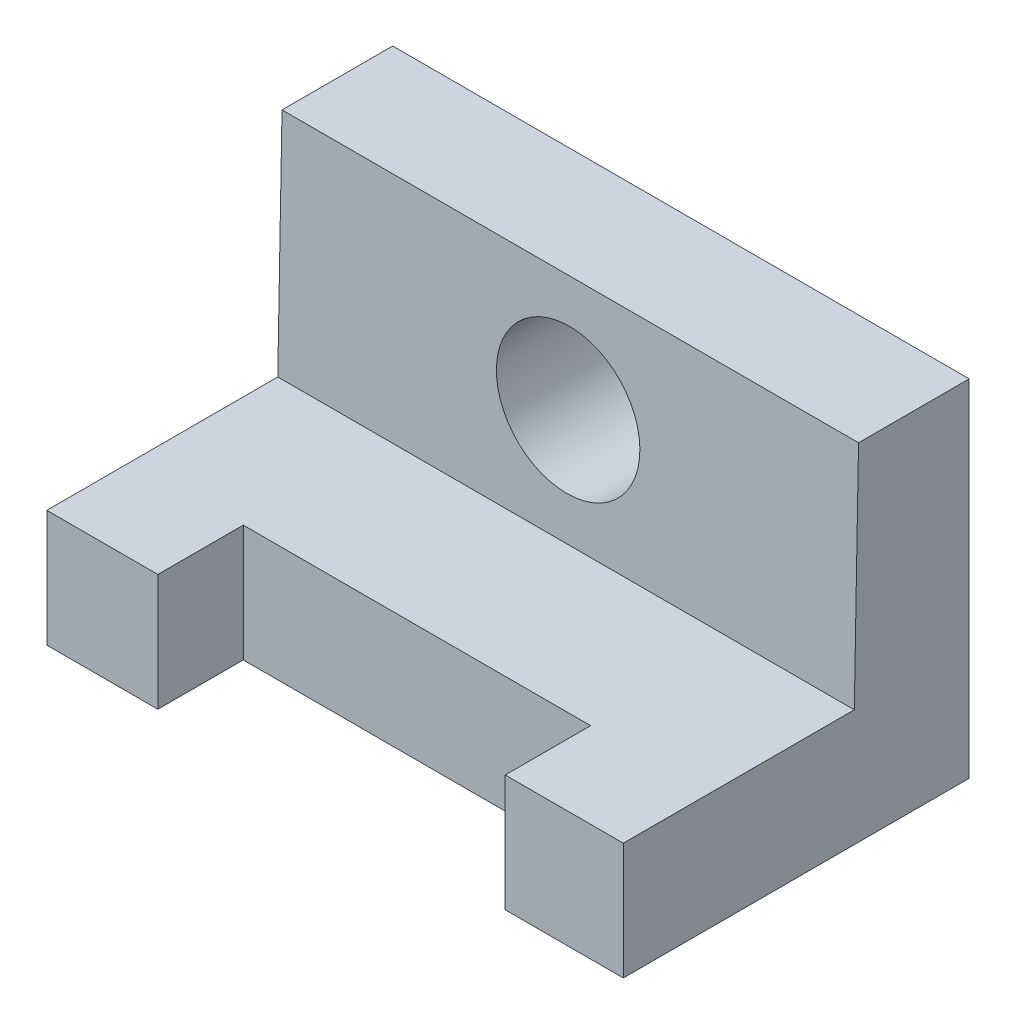
ISO-10303-21;
HEADER;
FILE_DESCRIPTION(('STEP AP214'),'2;1');
FILE_NAME('part.step','',(''),(''),'','','');
FILE_SCHEMA(('AUTOMOTIVE_DESIGN { 1 0 10303 214 1 1 1 1 }'));
ENDSEC;
DATA;
#1=APPLICATION_CONTEXT('core data for automotive mechanical design processes');
#2=APPLICATION_PROTOCOL_DEFINITION('international standard','automotive_design',2000,#1);
#3=PRODUCT_CONTEXT('',#1,'mechanical');
#4=PRODUCT('Part','Part','',(#3));
#5=PRODUCT_RELATED_PRODUCT_CATEGORY('part','',(#4));
#6=PRODUCT_DEFINITION_FORMATION('','',#4);
#7=PRODUCT_DEFINITION_CONTEXT('part definition',#1,'design');
#8=PRODUCT_DEFINITION('design','',#6,#7);
#9=PRODUCT_DEFINITION_SHAPE('','',#8);
#10=(LENGTH_UNIT() NAMED_UNIT(*) SI_UNIT(.MILLI.,.METRE.));
#11=(NAMED_UNIT(*) PLANE_ANGLE_UNIT() SI_UNIT($,.RADIAN.));
#12=(NAMED_UNIT(*) SI_UNIT($,.STERADIAN.) SOLID_ANGLE_UNIT());
#13=UNCERTAINTY_MEASURE_WITH_UNIT(LENGTH_MEASURE(1.E-05),#10,'distance_accuracy_value','');
#14=(GEOMETRIC_REPRESENTATION_CONTEXT(3) GLOBAL_UNCERTAINTY_ASSIGNED_CONTEXT((#13)) GLOBAL_UNIT_ASSIGNED_CONTEXT((#10,
#11,#12)) REPRESENTATION_CONTEXT('',''));
#15=CARTESIAN_POINT('',(0.,0.,0.));
#16=DIRECTION('',(0.,0.,1.));
#17=DIRECTION('',(1.,0.,0.));
#18=AXIS2_PLACEMENT_3D('',#15,#16,#17);
#19=CARTESIAN_POINT('',(100.,-39.7468730431932,60.));
#20=DIRECTION('',(0.,1.,0.));
#21=DIRECTION('',(0.,0.,1.));
#22=AXIS2_PLACEMENT_3D('',#19,#20,#21);
#23=PLANE('',#22);
#24=DIRECTION('',(-1.,0.,0.));
#25=VECTOR('',#24,1.);
#26=CARTESIAN_POINT('',(100.,-39.7468730431932,60.));
#27=LINE('',#26,#25);
#28=CARTESIAN_POINT('',(19.2657676805751,-39.7468730431932,60.));
#29=VERTEX_POINT('',#28);
#30=CARTESIAN_POINT('',(0.,-39.7468730431932,60.));
#31=VERTEX_POINT('',#30);
#32=EDGE_CURVE('E122',#29,#31,#27,.T.);
#33=ORIENTED_EDGE('',*,*,#32,.F.);
#34=DIRECTION('',(0.,0.,-1.));
#35=VECTOR('',#34,1.);
#36=CARTESIAN_POINT('',(19.2657676805751,-39.7468730431932,60.));
#37=LINE('',#36,#35);
#38=CARTESIAN_POINT('',(19.2657676805751,-39.7468730431932,45.1840187500569));
#39=VERTEX_POINT('',#38);
#40=EDGE_CURVE('E204',#29,#39,#37,.T.);
#41=ORIENTED_EDGE('',*,*,#40,.T.);
#42=DIRECTION('',(1.,0.,0.));
#43=VECTOR('',#42,1.);
#44=CARTESIAN_POINT('',(19.2657676805751,-39.7468730431932,45.1840187500569));
#45=LINE('',#44,#43);
#46=CARTESIAN_POINT('',(79.5162951566816,-39.7468730431932,45.1840187500569));
#47=VERTEX_POINT('',#46);
#48=EDGE_CURVE('E187',#39,#47,#45,.T.);
#49=ORIENTED_EDGE('',*,*,#48,.T.);
#50=DIRECTION('',(0.,0.,-1.));
#51=VECTOR('',#50,1.);
#52=CARTESIAN_POINT('',(79.5162951566816,-39.7468730431932,60.));
#53=LINE('',#52,#51);
#54=CARTESIAN_POINT('',(79.5162951566816,-39.7468730431932,60.));
#55=VERTEX_POINT('',#54);
#56=EDGE_CURVE('E212',#55,#47,#53,.T.);
#57=ORIENTED_EDGE('',*,*,#56,.F.);
#58=CARTESIAN_POINT('',(100.,-39.7468730431932,60.));
#59=VERTEX_POINT('',#58);
#60=EDGE_CURVE('E166',#59,#55,#27,.T.);
#61=ORIENTED_EDGE('',*,*,#60,.F.);
#62=DIRECTION('',(0.,0.,-1.));
#63=VECTOR('',#62,1.);
#64=CARTESIAN_POINT('',(100.,-39.7468730431932,60.));
#65=LINE('',#64,#63);
#66=CARTESIAN_POINT('',(100.,-39.7468730431932,19.9353804511396));
#67=VERTEX_POINT('',#66);
#68=EDGE_CURVE('E131',#59,#67,#65,.T.);
#69=ORIENTED_EDGE('',*,*,#68,.T.);
#70=DIRECTION('',(-1.,0.,0.));
#71=VECTOR('',#70,1.);
#72=CARTESIAN_POINT('',(100.,-39.7468730431932,19.9353804511396));
#73=LINE('',#72,#71);
#74=CARTESIAN_POINT('',(0.,-39.7468730431932,19.9353804511396));
#75=VERTEX_POINT('',#74);
#76=EDGE_CURVE('E63',#67,#75,#73,.T.);
#77=ORIENTED_EDGE('',*,*,#76,.T.);
#78=DIRECTION('',(0.,0.,-1.));
#79=VECTOR('',#78,1.);
#80=CARTESIAN_POINT('',(0.,-39.7468730431932,60.));
#81=LINE('',#80,#79);
#82=EDGE_CURVE('E160',#31,#75,#81,.T.);
#83=ORIENTED_EDGE('',*,*,#82,.F.);
#84=EDGE_LOOP('',(#33,#41,#49,#57,#61,#69,#77,#83));
#85=FACE_BOUND('',#84,.T.);
#86=ADVANCED_FACE('F39',(#85),#23,.T.);
#87=CARTESIAN_POINT('',(100.,-60.,60.));
#88=DIRECTION('',(0.,0.,1.));
#89=DIRECTION('',(1.,0.,0.));
#90=AXIS2_PLACEMENT_3D('',#87,#88,#89);
#91=PLANE('',#90);
#92=DIRECTION('',(-1.,0.,0.));
#93=VECTOR('',#92,1.);
#94=CARTESIAN_POINT('',(100.,-60.,60.));
#95=LINE('',#94,#93);
#96=CARTESIAN_POINT('',(19.2657676805751,-60.,60.));
#97=VERTEX_POINT('',#96);
#98=CARTESIAN_POINT('',(0.,-60.,60.));
#99=VERTEX_POINT('',#98);
#100=EDGE_CURVE('E123',#97,#99,#95,.T.);
#101=ORIENTED_EDGE('',*,*,#100,.F.);
#102=DIRECTION('',(0.,1.,0.));
#103=VECTOR('',#102,1.);
#104=CARTESIAN_POINT('',(19.2657676805751,-139.746873043193,60.));
#105=LINE('',#104,#103);
#106=EDGE_CURVE('E211',#97,#29,#105,.T.);
#107=ORIENTED_EDGE('',*,*,#106,.T.);
#108=ORIENTED_EDGE('',*,*,#32,.T.);
#109=DIRECTION('',(0.,1.,0.));
#110=VECTOR('',#109,1.);
#111=CARTESIAN_POINT('',(0.,-60.,60.));
#112=LINE('',#111,#110);
#113=EDGE_CURVE('E157',#99,#31,#112,.T.);
#114=ORIENTED_EDGE('',*,*,#113,.F.);
#115=EDGE_LOOP('',(#101,#107,#108,#114));
#116=FACE_BOUND('',#115,.T.);
#117=ADVANCED_FACE('F209',(#116),#91,.T.);
#118=CARTESIAN_POINT('',(100.,-60.,0.));
#119=DIRECTION('',(0.,-1.,0.));
#120=DIRECTION('',(0.,0.,-1.));
#121=AXIS2_PLACEMENT_3D('',#118,#119,#120);
#122=PLANE('',#121);
#123=DIRECTION('',(-1.,0.,0.));
#124=VECTOR('',#123,1.);
#125=CARTESIAN_POINT('',(100.,-60.,45.1840187500569));
#126=LINE('',#125,#124);
#127=CARTESIAN_POINT('',(79.5162951566816,-60.,45.1840187500569));
#128=VERTEX_POINT('',#127);
#129=CARTESIAN_POINT('',(19.2657676805751,-60.,45.1840187500569));
#130=VERTEX_POINT('',#129);
#131=EDGE_CURVE('E47',#128,#130,#126,.T.);
#132=ORIENTED_EDGE('',*,*,#131,.T.);
#133=DIRECTION('',(0.,0.,1.));
#134=VECTOR('',#133,1.);
#135=CARTESIAN_POINT('',(19.2657676805751,-60.,0.));
#136=LINE('',#135,#134);
#137=EDGE_CURVE('E11',#130,#97,#136,.T.);
#138=ORIENTED_EDGE('',*,*,#137,.T.);
#139=ORIENTED_EDGE('',*,*,#100,.T.);
#140=DIRECTION('',(0.,0.,1.));
#141=VECTOR('',#140,1.);
#142=CARTESIAN_POINT('',(0.,-60.,0.));
#143=LINE('',#142,#141);
#144=CARTESIAN_POINT('',(0.,-60.,0.));
#145=VERTEX_POINT('',#144);
#146=EDGE_CURVE('E154',#145,#99,#143,.T.);
#147=ORIENTED_EDGE('',*,*,#146,.F.);
#148=DIRECTION('',(-1.,0.,0.));
#149=VECTOR('',#148,1.);
#150=CARTESIAN_POINT('',(100.,-60.,0.));
#151=LINE('',#150,#149);
#152=CARTESIAN_POINT('',(100.,-60.,0.));
#153=VERTEX_POINT('',#152);
#154=EDGE_CURVE('E136',#153,#145,#151,.T.);
#155=ORIENTED_EDGE('',*,*,#154,.F.);
#156=DIRECTION('',(0.,0.,1.));
#157=VECTOR('',#156,1.);
#158=CARTESIAN_POINT('',(100.,-60.,0.));
#159=LINE('',#158,#157);
#160=CARTESIAN_POINT('',(100.,-60.,60.));
#161=VERTEX_POINT('',#160);
#162=EDGE_CURVE('E129',#153,#161,#159,.T.);
#163=ORIENTED_EDGE('',*,*,#162,.T.);
#164=CARTESIAN_POINT('',(79.5162951566816,-60.,60.));
#165=VERTEX_POINT('',#164);
#166=EDGE_CURVE('E110',#161,#165,#95,.T.);
#167=ORIENTED_EDGE('',*,*,#166,.T.);
#168=DIRECTION('',(0.,0.,1.));
#169=VECTOR('',#168,1.);
#170=CARTESIAN_POINT('',(79.5162951566816,-60.,0.));
#171=LINE('',#170,#169);
#172=EDGE_CURVE('E165',#128,#165,#171,.T.);
#173=ORIENTED_EDGE('',*,*,#172,.F.);
#174=EDGE_LOOP('',(#132,#138,#139,#147,#155,#163,#167,#173));
#175=FACE_BOUND('',#174,.T.);
#176=ADVANCED_FACE('F134',(#175),#122,.T.);
#177=CARTESIAN_POINT('',(100.,-39.7468730431932,19.9353804511396));
#178=DIRECTION('',(0.,0.0185469827700645,0.99982798992133));
#179=DIRECTION('',(0.,-0.99982798992133,0.0185469827700645));
#180=AXIS2_PLACEMENT_3D('',#177,#178,#179);
#181=PLANE('',#180);
#182=CARTESIAN_POINT('',(50.,-19.8734365215966,19.5667247538961));
#183=DIRECTION('',(0.,0.0185469827700645,0.99982798992133));
#184=DIRECTION('',(0.,-0.99982798992133,0.0185469827700645));
#185=AXIS2_PLACEMENT_3D('',#182,#183,#184);
#186=CIRCLE('',#185,12.4430002100972);
#187=CARTESIAN_POINT('',(50.,-32.3142964102488,19.7975048644007));
#188=VERTEX_POINT('',#187);
#189=EDGE_CURVE('E174',#188,#188,#186,.T.);
#190=ORIENTED_EDGE('',*,*,#189,.F.);
#191=EDGE_LOOP('',(#190));
#192=FACE_BOUND('',#191,.T.);
#193=DIRECTION('',(0.,0.99982798992133,-0.0185469827700645));
#194=VECTOR('',#193,1.);
#195=CARTESIAN_POINT('',(0.,-39.7468730431932,19.9353804511396));
#196=LINE('',#195,#194);
#197=CARTESIAN_POINT('',(0.,0.,19.1980690566526));
#198=VERTEX_POINT('',#197);
#199=EDGE_CURVE('E144',#75,#198,#196,.T.);
#200=ORIENTED_EDGE('',*,*,#199,.F.);
#201=ORIENTED_EDGE('',*,*,#76,.F.);
#202=DIRECTION('',(0.,0.99982798992133,-0.0185469827700645));
#203=VECTOR('',#202,1.);
#204=CARTESIAN_POINT('',(100.,-39.7468730431932,19.9353804511396));
#205=LINE('',#204,#203);
#206=CARTESIAN_POINT('',(100.,0.,19.1980690566526));
#207=VERTEX_POINT('',#206);
#208=EDGE_CURVE('E163',#67,#207,#205,.T.);
#209=ORIENTED_EDGE('',*,*,#208,.T.);
#210=DIRECTION('',(-1.,0.,0.));
#211=VECTOR('',#210,1.);
#212=CARTESIAN_POINT('',(100.,0.,19.1980690566526));
#213=LINE('',#212,#211);
#214=EDGE_CURVE('E96',#207,#198,#213,.T.);
#215=ORIENTED_EDGE('',*,*,#214,.T.);
#216=EDGE_LOOP('',(#200,#201,#209,#215));
#217=FACE_BOUND('',#216,.T.);
#218=ADVANCED_FACE('F41',(#192,#217),#181,.T.);
#219=DIRECTION('',(0.,1.,0.));
#220=VECTOR('',#219,1.);
#221=CARTESIAN_POINT('',(79.5162951566816,-139.746873043193,60.));
#222=LINE('',#221,#220);
#223=EDGE_CURVE('E118',#165,#55,#222,.T.);
#224=ORIENTED_EDGE('',*,*,#223,.F.);
#225=ORIENTED_EDGE('',*,*,#166,.F.);
#226=DIRECTION('',(0.,1.,0.));
#227=VECTOR('',#226,1.);
#228=CARTESIAN_POINT('',(100.,-60.,60.));
#229=LINE('',#228,#227);
#230=EDGE_CURVE('E114',#161,#59,#229,.T.);
#231=ORIENTED_EDGE('',*,*,#230,.T.);
#232=ORIENTED_EDGE('',*,*,#60,.T.);
#233=EDGE_LOOP('',(#224,#225,#231,#232));
#234=FACE_BOUND('',#233,.T.);
#235=ADVANCED_FACE('F112',(#234),#91,.T.);
#236=CARTESIAN_POINT('',(100.,0.,0.));
#237=DIRECTION('',(0.,0.,-1.));
#238=DIRECTION('',(0.,1.,0.));
#239=AXIS2_PLACEMENT_3D('',#236,#237,#238);
#240=PLANE('',#239);
#241=CARTESIAN_POINT('',(50.,-20.2364026623081,0.));
#242=DIRECTION('',(0.,0.,-1.));
#243=DIRECTION('',(0.,1.,0.));
#244=AXIS2_PLACEMENT_3D('',#241,#242,#243);
#245=ELLIPSE('',#244,12.4451408997625,12.4430002100972);
#246=CARTESIAN_POINT('',(50.,-7.79126176254567,0.));
#247=VERTEX_POINT('',#246);
#248=EDGE_CURVE('E148',#247,#247,#245,.T.);
#249=ORIENTED_EDGE('',*,*,#248,.F.);
#250=EDGE_LOOP('',(#249));
#251=FACE_BOUND('',#250,.T.);
#252=DIRECTION('',(0.,-1.,0.));
#253=VECTOR('',#252,1.);
#254=CARTESIAN_POINT('',(0.,0.,0.));
#255=LINE('',#254,#253);
#256=CARTESIAN_POINT('',(0.,0.,0.));
#257=VERTEX_POINT('',#256);
#258=EDGE_CURVE('E151',#257,#145,#255,.T.);
#259=ORIENTED_EDGE('',*,*,#258,.F.);
#260=DIRECTION('',(-1.,0.,0.));
#261=VECTOR('',#260,1.);
#262=CARTESIAN_POINT('',(100.,0.,0.));
#263=LINE('',#262,#261);
#264=CARTESIAN_POINT('',(100.,0.,0.));
#265=VERTEX_POINT('',#264);
#266=EDGE_CURVE('E169',#265,#257,#263,.T.);
#267=ORIENTED_EDGE('',*,*,#266,.F.);
#268=DIRECTION('',(0.,-1.,0.));
#269=VECTOR('',#268,1.);
#270=CARTESIAN_POINT('',(100.,0.,0.));
#271=LINE('',#270,#269);
#272=EDGE_CURVE('E137',#265,#153,#271,.T.);
#273=ORIENTED_EDGE('',*,*,#272,.T.);
#274=ORIENTED_EDGE('',*,*,#154,.T.);
#275=EDGE_LOOP('',(#259,#267,#273,#274));
#276=FACE_BOUND('',#275,.T.);
#277=ADVANCED_FACE('F241',(#251,#276),#240,.T.);
#278=CARTESIAN_POINT('',(100.,0.,19.1980690566526));
#279=DIRECTION('',(0.,1.,0.));
#280=DIRECTION('',(0.,0.,1.));
#281=AXIS2_PLACEMENT_3D('',#278,#279,#280);
#282=PLANE('',#281);
#283=DIRECTION('',(0.,0.,-1.));
#284=VECTOR('',#283,1.);
#285=CARTESIAN_POINT('',(0.,0.,19.1980690566526));
#286=LINE('',#285,#284);
#287=EDGE_CURVE('E147',#198,#257,#286,.T.);
#288=ORIENTED_EDGE('',*,*,#287,.F.);
#289=ORIENTED_EDGE('',*,*,#214,.F.);
#290=DIRECTION('',(0.,0.,-1.));
#291=VECTOR('',#290,1.);
#292=CARTESIAN_POINT('',(100.,0.,19.1980690566526));
#293=LINE('',#292,#291);
#294=EDGE_CURVE('E139',#207,#265,#293,.T.);
#295=ORIENTED_EDGE('',*,*,#294,.T.);
#296=ORIENTED_EDGE('',*,*,#266,.T.);
#297=EDGE_LOOP('',(#288,#289,#295,#296));
#298=FACE_BOUND('',#297,.T.);
#299=ADVANCED_FACE('F197',(#298),#282,.T.);
#300=CARTESIAN_POINT('',(100.,0.,0.));
#301=DIRECTION('',(-1.,0.,0.));
#302=DIRECTION('',(0.,0.,1.));
#303=AXIS2_PLACEMENT_3D('',#300,#301,#302);
#304=PLANE('',#303);
#305=ORIENTED_EDGE('',*,*,#208,.F.);
#306=ORIENTED_EDGE('',*,*,#68,.F.);
#307=ORIENTED_EDGE('',*,*,#230,.F.);
#308=ORIENTED_EDGE('',*,*,#162,.F.);
#309=ORIENTED_EDGE('',*,*,#272,.F.);
#310=ORIENTED_EDGE('',*,*,#294,.F.);
#311=EDGE_LOOP('',(#305,#306,#307,#308,#309,#310));
#312=FACE_BOUND('',#311,.T.);
#313=ADVANCED_FACE('F127',(#312),#304,.F.);
#314=CARTESIAN_POINT('',(0.,0.,0.));
#315=DIRECTION('',(-1.,0.,0.));
#316=DIRECTION('',(0.,0.,1.));
#317=AXIS2_PLACEMENT_3D('',#314,#315,#316);
#318=PLANE('',#317);
#319=ORIENTED_EDGE('',*,*,#199,.T.);
#320=ORIENTED_EDGE('',*,*,#287,.T.);
#321=ORIENTED_EDGE('',*,*,#258,.T.);
#322=ORIENTED_EDGE('',*,*,#146,.T.);
#323=ORIENTED_EDGE('',*,*,#113,.T.);
#324=ORIENTED_EDGE('',*,*,#82,.T.);
#325=EDGE_LOOP('',(#319,#320,#321,#322,#323,#324));
#326=FACE_BOUND('',#325,.T.);
#327=ADVANCED_FACE('F200',(#326),#318,.T.);
#328=CARTESIAN_POINT('',(50.,-21.7281347986031,-80.4160742382369));
#329=DIRECTION('',(0.,0.0185469827700645,0.99982798992133));
#330=DIRECTION('',(0.,-0.99982798992133,0.0185469827700645));
#331=AXIS2_PLACEMENT_3D('',#328,#329,#330);
#332=CYLINDRICAL_SURFACE('',#331,12.4430002100972);
#333=ORIENTED_EDGE('',*,*,#248,.T.);
#334=EDGE_LOOP('',(#333));
#335=FACE_BOUND('',#334,.T.);
#336=ORIENTED_EDGE('',*,*,#189,.T.);
#337=EDGE_LOOP('',(#336));
#338=FACE_BOUND('',#337,.T.);
#339=ADVANCED_FACE('F253',(#335,#338),#332,.F.);
#340=CARTESIAN_POINT('',(19.2657676805751,-139.746873043193,60.));
#341=DIRECTION('',(1.,0.,0.));
#342=DIRECTION('',(0.,0.,-1.));
#343=AXIS2_PLACEMENT_3D('',#340,#341,#342);
#344=PLANE('',#343);
#345=DIRECTION('',(0.,1.,0.));
#346=VECTOR('',#345,1.);
#347=CARTESIAN_POINT('',(19.2657676805751,-139.746873043193,45.1840187500569));
#348=LINE('',#347,#346);
#349=EDGE_CURVE('E184',#130,#39,#348,.T.);
#350=ORIENTED_EDGE('',*,*,#349,.T.);
#351=ORIENTED_EDGE('',*,*,#40,.F.);
#352=ORIENTED_EDGE('',*,*,#106,.F.);
#353=ORIENTED_EDGE('',*,*,#137,.F.);
#354=EDGE_LOOP('',(#350,#351,#352,#353));
#355=FACE_BOUND('',#354,.T.);
#356=ADVANCED_FACE('F228',(#355),#344,.T.);
#357=CARTESIAN_POINT('',(19.2657676805751,-139.746873043193,45.1840187500569));
#358=DIRECTION('',(0.,0.,1.));
#359=DIRECTION('',(1.,0.,0.));
#360=AXIS2_PLACEMENT_3D('',#357,#358,#359);
#361=PLANE('',#360);
#362=DIRECTION('',(0.,1.,0.));
#363=VECTOR('',#362,1.);
#364=CARTESIAN_POINT('',(79.5162951566816,-139.746873043193,45.1840187500569));
#365=LINE('',#364,#363);
#366=EDGE_CURVE('E54',#128,#47,#365,.T.);
#367=ORIENTED_EDGE('',*,*,#366,.T.);
#368=ORIENTED_EDGE('',*,*,#48,.F.);
#369=ORIENTED_EDGE('',*,*,#349,.F.);
#370=ORIENTED_EDGE('',*,*,#131,.F.);
#371=EDGE_LOOP('',(#367,#368,#369,#370));
#372=FACE_BOUND('',#371,.T.);
#373=ADVANCED_FACE('F180',(#372),#361,.T.);
#374=CARTESIAN_POINT('',(79.5162951566816,-139.746873043193,60.));
#375=DIRECTION('',(1.,0.,0.));
#376=DIRECTION('',(0.,0.,-1.));
#377=AXIS2_PLACEMENT_3D('',#374,#375,#376);
#378=PLANE('',#377);
#379=ORIENTED_EDGE('',*,*,#172,.T.);
#380=ORIENTED_EDGE('',*,*,#223,.T.);
#381=ORIENTED_EDGE('',*,*,#56,.T.);
#382=ORIENTED_EDGE('',*,*,#366,.F.);
#383=EDGE_LOOP('',(#379,#380,#381,#382));
#384=FACE_BOUND('',#383,.T.);
#385=ADVANCED_FACE('F222',(#384),#378,.F.);
#386=CLOSED_SHELL('',(#86,#117,#176,#218,#235,#277,#299,#313,#327,#339,#356,#373,#385));
#387=MANIFOLD_SOLID_BREP('B2',#386);
#388=ADVANCED_BREP_SHAPE_REPRESENTATION('',(#18,#387),#14);
#389=SHAPE_DEFINITION_REPRESENTATION(#9,#388);
ENDSEC;
END-ISO-10303-21;
